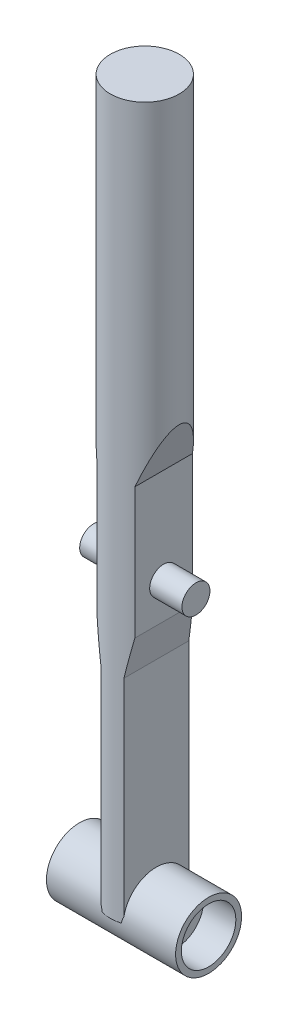
ISO-10303-21;
HEADER;
FILE_DESCRIPTION(('STEP AP214'),'2;1');
FILE_NAME('part.step','',(''),(''),'','','');
FILE_SCHEMA(('AUTOMOTIVE_DESIGN { 1 0 10303 214 1 1 1 1 }'));
ENDSEC;
DATA;
#1=APPLICATION_CONTEXT('core data for automotive mechanical design processes');
#2=APPLICATION_PROTOCOL_DEFINITION('international standard','automotive_design',2000,#1);
#3=PRODUCT_CONTEXT('',#1,'mechanical');
#4=PRODUCT('Part','Part','',(#3));
#5=PRODUCT_RELATED_PRODUCT_CATEGORY('part','',(#4));
#6=PRODUCT_DEFINITION_FORMATION('','',#4);
#7=PRODUCT_DEFINITION_CONTEXT('part definition',#1,'design');
#8=PRODUCT_DEFINITION('design','',#6,#7);
#9=PRODUCT_DEFINITION_SHAPE('','',#8);
#10=(LENGTH_UNIT() NAMED_UNIT(*) SI_UNIT(.MILLI.,.METRE.));
#11=(NAMED_UNIT(*) PLANE_ANGLE_UNIT() SI_UNIT($,.RADIAN.));
#12=(NAMED_UNIT(*) SI_UNIT($,.STERADIAN.) SOLID_ANGLE_UNIT());
#13=UNCERTAINTY_MEASURE_WITH_UNIT(LENGTH_MEASURE(1.E-05),#10,'distance_accuracy_value','');
#14=(GEOMETRIC_REPRESENTATION_CONTEXT(3) GLOBAL_UNCERTAINTY_ASSIGNED_CONTEXT((#13)) GLOBAL_UNIT_ASSIGNED_CONTEXT((#10,
#11,#12)) REPRESENTATION_CONTEXT('',''));
#15=CARTESIAN_POINT('',(0.,0.,0.));
#16=DIRECTION('',(0.,0.,1.));
#17=DIRECTION('',(1.,0.,0.));
#18=AXIS2_PLACEMENT_3D('',#15,#16,#17);
#19=CARTESIAN_POINT('',(13.1644790319999,1783.90993744682,39.9999497523784));
#20=DIRECTION('',(0.,-1.,0.));
#21=DIRECTION('',(0.,0.,-1.));
#22=AXIS2_PLACEMENT_3D('',#19,#20,#21);
#23=PLANE('',#22);
#24=DIRECTION('',(-1.,0.,0.));
#25=VECTOR('',#24,1.);
#26=CARTESIAN_POINT('',(73.8838807005568,1783.90993744682,38.3479186239237));
#27=LINE('',#26,#25);
#28=CARTESIAN_POINT('',(11.151054807447,1783.90993744682,38.3479186239237));
#29=VERTEX_POINT('',#28);
#30=CARTESIAN_POINT('',(-11.6026950748903,1783.90993744682,38.3479186239237));
#31=VERTEX_POINT('',#30);
#32=EDGE_CURVE('E11',#29,#31,#27,.T.);
#33=ORIENTED_EDGE('',*,*,#32,.F.);
#34=CARTESIAN_POINT('',(-0.22582013372161,1783.90993744682,-5.02476216061724E-05));
#35=DIRECTION('',(0.,-1.,0.));
#36=DIRECTION('',(0.,0.,-1.));
#37=AXIS2_PLACEMENT_3D('',#34,#35,#36);
#38=CIRCLE('',#37,40.);
#39=EDGE_CURVE('E121',#29,#31,#38,.T.);
#40=ORIENTED_EDGE('',*,*,#39,.T.);
#41=EDGE_LOOP('',(#33,#40));
#42=FACE_BOUND('',#41,.T.);
#43=ADVANCED_FACE('F38',(#42),#23,.T.);
#44=CARTESIAN_POINT('',(-0.22582013372161,2463.28027004074,-5.02476216061724E-05));
#45=DIRECTION('',(0.,-1.,0.));
#46=DIRECTION('',(0.,0.,-1.));
#47=AXIS2_PLACEMENT_3D('',#44,#45,#46);
#48=CYLINDRICAL_SURFACE('',#47,40.);
#49=ORIENTED_EDGE('',*,*,#39,.F.);
#50=CARTESIAN_POINT('',(11.151054807447,1783.90993744682,38.3479186239237));
#51=CARTESIAN_POINT('',(11.1510358402569,1784.09591639511,38.3479213542535));
#52=CARTESIAN_POINT('',(11.1556177414297,1784.2818613936,38.346565203044));
#53=CARTESIAN_POINT('',(11.1738052117104,1784.65322992802,38.3411635748634));
#54=CARTESIAN_POINT('',(11.1874087581552,1784.83865357148,38.3371187007066));
#55=CARTESIAN_POINT('',(11.2413814256477,1785.39249373955,38.321024495581));
#56=CARTESIAN_POINT('',(11.2949147099998,1785.75958385275,38.3050152190416));
#57=CARTESIAN_POINT('',(11.4324496884293,1786.47992446487,38.2633748600251));
#58=CARTESIAN_POINT('',(11.5158446973372,1786.83330534353,38.2379350338814));
#59=CARTESIAN_POINT('',(11.7090440877346,1787.53217069556,38.1780751547063));
#60=CARTESIAN_POINT('',(11.8188681867846,1787.8776490615,38.1436483952935));
#61=CARTESIAN_POINT('',(12.1378166092028,1788.77824521613,38.0418142192994));
#62=CARTESIAN_POINT('',(12.3655013436854,1789.32598045958,37.967402472921));
#63=CARTESIAN_POINT('',(12.8628049377956,1790.39878929427,37.7988506813096));
#64=CARTESIAN_POINT('',(13.132455262005,1790.92384550094,37.7046958147074));
#65=CARTESIAN_POINT('',(13.7044431518323,1791.96026627469,37.4971695639313));
#66=CARTESIAN_POINT('',(14.0071373461986,1792.47138770105,37.383579061378));
#67=CARTESIAN_POINT('',(14.6332497202106,1793.47617101262,37.1391622151639));
#68=CARTESIAN_POINT('',(14.9566626497798,1793.9698372721,37.0083402291148));
#69=CARTESIAN_POINT('',(15.6767418270358,1795.02905902546,36.7053574222309));
#70=CARTESIAN_POINT('',(16.0762056407638,1795.59178310209,36.5299825680185));
#71=CARTESIAN_POINT('',(16.8880546432706,1796.70030615409,36.1567629987183));
#72=CARTESIAN_POINT('',(17.3004426922283,1797.2461013291,35.9589132840729));
#73=CARTESIAN_POINT('',(18.1334827054965,1798.32338057592,35.54081962711));
#74=CARTESIAN_POINT('',(18.554141412768,1798.85485205553,35.3205567442733));
#75=CARTESIAN_POINT('',(19.3997195453942,1799.90447000025,34.8578115070049));
#76=CARTESIAN_POINT('',(19.8246386290091,1800.42261752242,34.6153309222342));
#77=CARTESIAN_POINT('',(20.6748294679453,1801.44516690428,34.1087035379585));
#78=CARTESIAN_POINT('',(21.1000970750271,1801.94960250364,33.844617853942));
#79=CARTESIAN_POINT('',(21.9499184582111,1802.94669243953,33.293988389982));
#80=CARTESIAN_POINT('',(22.3744722232596,1803.43934659515,33.0074442654861));
#81=CARTESIAN_POINT('',(23.2207748185555,1804.41279899594,32.4117503226011));
#82=CARTESIAN_POINT('',(23.6425248792086,1804.89360273236,32.1026112480266));
#83=CARTESIAN_POINT('',(24.4817008370615,1805.84342050969,31.4613130186487));
#84=CARTESIAN_POINT('',(24.8991267337329,1806.31243454915,31.1291538610325));
#85=CARTESIAN_POINT('',(26.0713597488342,1807.62177338318,30.1566605460357));
#86=CARTESIAN_POINT('',(26.8194205470995,1808.44808951926,29.4888240749158));
#87=CARTESIAN_POINT('',(27.9196637300987,1809.65409621248,28.4269046484567));
#88=CARTESIAN_POINT('',(28.2828035405589,1810.05055655366,28.0628666570179));
#89=CARTESIAN_POINT('',(29.0007974329042,1810.83178103705,27.3143018202486));
#90=CARTESIAN_POINT('',(29.3556491100116,1811.21654179419,26.9297691320939));
#91=CARTESIAN_POINT('',(30.4047609137449,1812.35078704484,25.7463651120054));
#92=CARTESIAN_POINT('',(31.0847947331443,1813.08156486088,24.9165225513618));
#93=CARTESIAN_POINT('',(32.3963022162756,1814.48495641815,23.1729299971066));
#94=CARTESIAN_POINT('',(33.0277725352854,1815.15756615356,22.2591742336192));
#95=CARTESIAN_POINT('',(34.0722969628933,1816.26658225071,20.5992660844231));
#96=CARTESIAN_POINT('',(34.4991354302263,1816.71860606802,19.8721850856245));
#97=CARTESIAN_POINT('',(35.3147685203705,1817.58069098421,18.3736723254074));
#98=CARTESIAN_POINT('',(35.7035850518426,1817.99077625487,17.6022665161573));
#99=CARTESIAN_POINT('',(36.4379658333624,1818.76412796363,16.0165056392759));
#100=CARTESIAN_POINT('',(36.783533066156,1819.12739763048,15.2021535390052));
#101=CARTESIAN_POINT('',(37.4258012286149,1819.80174521659,13.5334185248611));
#102=CARTESIAN_POINT('',(37.7225013019953,1820.11282222129,12.6790349098642));
#103=CARTESIAN_POINT('',(38.2642070533358,1820.68025328352,10.9255025144571));
#104=CARTESIAN_POINT('',(38.5086524301275,1820.93601452923,10.0259850032244));
#105=CARTESIAN_POINT('',(38.8295305729571,1821.2715244768,8.65446042684338));
#106=CARTESIAN_POINT('',(38.9288728363315,1821.37535430593,8.19348772699021));
#107=CARTESIAN_POINT('',(39.1117233640909,1821.56640855666,7.26502796155388));
#108=CARTESIAN_POINT('',(39.1952338122495,1821.65363526844,6.79754180397305));
#109=CARTESIAN_POINT('',(39.3458352619158,1821.81090232801,5.85747014449314));
#110=CARTESIAN_POINT('',(39.4129395762325,1821.88095661055,5.38488910419132));
#111=CARTESIAN_POINT('',(39.5303756406419,1822.00353438447,4.43545049503655));
#112=CARTESIAN_POINT('',(39.5807096973115,1822.05606028671,3.95859352356658));
#113=CARTESIAN_POINT('',(39.6642734557412,1822.14325327285,3.00178120800167));
#114=CARTESIAN_POINT('',(39.6975044138291,1822.17792166851,2.52182609410752));
#115=CARTESIAN_POINT('',(39.7466430109122,1822.22918295208,1.56012057286972));
#116=CARTESIAN_POINT('',(39.7625513981847,1822.24577662076,1.07837024397549));
#117=CARTESIAN_POINT('',(39.781909920586,1822.26596978841,-0.220867700901089));
#118=CARTESIAN_POINT('',(39.7690166818901,1822.25252241095,-1.0389881332275));
#119=CARTESIAN_POINT('',(39.6933147348628,1822.17355155716,-2.67017283391678));
#120=CARTESIAN_POINT('',(39.6305121186687,1822.10803443666,-3.48323770717442));
#121=CARTESIAN_POINT('',(39.4562499027128,1821.92617181877,-5.09838721563224));
#122=CARTESIAN_POINT('',(39.3447897144804,1821.80982570663,-5.90047171791349));
#123=CARTESIAN_POINT('',(39.0753011653734,1821.52837041083,-7.48805758127786));
#124=CARTESIAN_POINT('',(38.917271163761,1821.36325950909,-8.27355835704155));
#125=CARTESIAN_POINT('',(38.5625468105421,1820.99237225743,-9.80106348531759));
#126=CARTESIAN_POINT('',(38.3670813003323,1820.7878874584,-10.5436695010727));
#127=CARTESIAN_POINT('',(37.9377817708324,1820.33838327532,-12.0050272969815));
#128=CARTESIAN_POINT('',(37.7039498713555,1820.09336613075,-12.7237803924164));
#129=CARTESIAN_POINT('',(37.2010720865559,1819.56586711399,-14.1347165232186));
#130=CARTESIAN_POINT('',(36.9320231878642,1819.28338203579,-14.8268972783418));
#131=CARTESIAN_POINT('',(36.3619033576712,1818.68401947755,-16.1827400638659));
#132=CARTESIAN_POINT('',(36.0608257212933,1818.36713479603,-16.8463960819287));
#133=CARTESIAN_POINT('',(35.5157201938424,1817.79253298416,-17.9671901701323));
#134=CARTESIAN_POINT('',(35.2784372109143,1817.54215342881,-18.4314192711015));
#135=CARTESIAN_POINT('',(34.7898771096462,1817.02598632161,-19.3434877081235));
#136=CARTESIAN_POINT('',(34.5386025709473,1816.76020160968,-19.7913300403597));
#137=CARTESIAN_POINT('',(33.7652453550142,1815.94104372099,-21.1103901442752));
#138=CARTESIAN_POINT('',(33.2237208236953,1815.36596338311,-21.9569540469952));
#139=CARTESIAN_POINT('',(32.096479217992,1814.1645414238,-23.5850505672016));
#140=CARTESIAN_POINT('',(31.5106586904568,1813.53807949278,-24.3664213855391));
#141=CARTESIAN_POINT('',(30.3036784559777,1812.24142626211,-25.8626354668342));
#142=CARTESIAN_POINT('',(29.6825195109568,1811.57123590523,-26.5774801632702));
#143=CARTESIAN_POINT('',(28.6169305830848,1810.41472655431,-27.7217876068017));
#144=CARTESIAN_POINT('',(28.1800775963188,1809.93877717054,-28.1689630756174));
#145=CARTESIAN_POINT('',(27.2955104971928,1808.97044826142,-29.033804559072));
#146=CARTESIAN_POINT('',(26.8477966422275,1808.47806912534,-29.451471272131));
#147=CARTESIAN_POINT('',(25.9433333566323,1807.47764950331,-30.2579870702445));
#148=CARTESIAN_POINT('',(25.4865793223175,1806.96960096021,-30.646820967586));
#149=CARTESIAN_POINT('',(24.5663330767563,1805.9388168943,-31.3959274398791));
#150=CARTESIAN_POINT('',(24.1028410611918,1805.41608179761,-31.7562008423204));
#151=CARTESIAN_POINT('',(23.1718365024961,1804.35696079516,-32.4482498702702));
#152=CARTESIAN_POINT('',(22.7043295350328,1803.82059226568,-32.7800596236576));
#153=CARTESIAN_POINT('',(21.7670834831546,1802.7336031048,-33.416107850636));
#154=CARTESIAN_POINT('',(21.2973443005267,1802.18298184149,-33.7203450990464));
#155=CARTESIAN_POINT('',(20.3586841314991,1801.06742550008,-34.3014007515062));
#156=CARTESIAN_POINT('',(19.8897628253912,1800.5024990866,-34.5782352770359));
#157=CARTESIAN_POINT('',(18.9558839222512,1799.35709542077,-35.1048849104531));
#158=CARTESIAN_POINT('',(18.4909258227398,1798.77662017965,-35.3547034919741));
#159=CARTESIAN_POINT('',(17.6481276774097,1797.6989648637,-35.787008824613));
#160=CARTESIAN_POINT('',(17.2689760005268,1797.20449850738,-35.9737069606251));
#161=CARTESIAN_POINT('',(16.5198712105968,1796.20204965604,-36.3284613980803));
#162=CARTESIAN_POINT('',(16.1499179844365,1795.6940673274,-36.496517928847));
#163=CARTESIAN_POINT('',(15.4235630449023,1794.66189553031,-36.8138247294239));
#164=CARTESIAN_POINT('',(15.0671754170339,1794.13769018846,-36.9630558052403));
#165=CARTESIAN_POINT('',(14.3751102841695,1793.0706780946,-37.2418503991261));
#166=CARTESIAN_POINT('',(14.0394278006397,1792.52787586341,-37.3714186561316));
#167=CARTESIAN_POINT('',(13.502314718329,1791.59899317104,-37.571209885838));
#168=CARTESIAN_POINT('',(13.2925568295021,1791.21895598226,-37.6470793376391));
#169=CARTESIAN_POINT('',(12.8914086874593,1790.44730334226,-37.7887189703592));
#170=CARTESIAN_POINT('',(12.7000207925314,1790.05568641289,-37.8544878552443));
#171=CARTESIAN_POINT('',(12.3422611962941,1789.26231629565,-37.9747622399475));
#172=CARTESIAN_POINT('',(12.1757444627156,1788.86063921862,-38.0293337939355));
#173=CARTESIAN_POINT('',(11.8731538883538,1788.04456776127,-38.126683132196));
#174=CARTESIAN_POINT('',(11.7370642398866,1787.63018011227,-38.1694670431605));
#175=CARTESIAN_POINT('',(11.5458073009372,1786.94363941954,-38.2287678158522));
#176=CARTESIAN_POINT('',(11.4792571749622,1786.67497886846,-38.249165979773));
#177=CARTESIAN_POINT('',(11.3633284255502,1786.1336658935,-38.2844503207378));
#178=CARTESIAN_POINT('',(11.3139441334563,1785.86101481845,-38.2993383175044));
#179=CARTESIAN_POINT('',(11.2335636086294,1785.30963294681,-38.3234689533207));
#180=CARTESIAN_POINT('',(11.2027778722059,1785.03086825828,-38.3326470012477));
#181=CARTESIAN_POINT('',(11.1614447172302,1784.47140555754,-38.3449365074796));
#182=CARTESIAN_POINT('',(11.1509200835638,1784.19070572458,-38.3480411359051));
#183=CARTESIAN_POINT('',(11.1510548074471,1783.90993744682,-38.3480191191669));
#184=B_SPLINE_CURVE_WITH_KNOTS('',3,(#50,#51,#52,#53,#54,#55,#56,#57,#58,#59,#60,#61,#62,#63,
#64,#65,#66,#67,#68,#69,#70,#71,#72,#73,#74,#75,#76,#77,#78,#79,#80,#81,#82,#83,#84,#85,#86,#87,
#88,#89,#90,#91,#92,#93,#94,#95,#96,#97,#98,#99,#100,#101,#102,#103,#104,#105,#106,#107,#108,
#109,#110,#111,#112,#113,#114,#115,#116,#117,#118,#119,#120,#121,#122,#123,#124,#125,#126,#127,
#128,#129,#130,#131,#132,#133,#134,#135,#136,#137,#138,#139,#140,#141,#142,#143,#144,#145,#146,
#147,#148,#149,#150,#151,#152,#153,#154,#155,#156,#157,#158,#159,#160,#161,#162,#163,#164,#165,
#166,#167,#168,#169,#170,#171,#172,#173,#174,#175,#176,#177,#178,#179,#180,#181,#182,#183),
.UNSPECIFIED.,.F.,.F.,(4,2,2,2,2,2,2,2,2,2,2,2,2,2,2,2,2,2,2,2,2,2,2,2,2,2,2,2,2,2,2,2,2,2,2,2,
2,2,2,2,2,2,2,2,2,2,2,2,2,2,2,2,2,2,2,2,2,2,2,2,2,2,2,2,2,2,4),(0.,0.557810990211071,
1.11549696082689,2.22757115222124,3.3182266047878,4.40969828297229,6.19991750653114,
7.99148550916141,9.80477207782546,11.6176009678255,13.7528754978129,15.8886259556099,
18.0261964850073,20.1635969026419,22.2951473858825,24.4267305773139,26.5573067213381,
28.6878831256859,32.5820796835899,34.5295475567021,36.4775736336967,40.3672035937408,
44.2571012054612,47.1246084212579,49.9904534894255,52.8561008017026,55.7217983225342,
58.616832614496,60.0649006799878,61.5127688595179,62.95945823309,64.4059485471569,
65.8523325924389,67.2986541562641,69.7502001581431,72.201446960517,74.6527234093864,
77.1040862314358,79.4856599074153,81.8671020413679,84.2487480785663,86.6308936729006,
88.3653744868076,90.0995365643684,93.5685469761598,97.0459255744707,100.523229226253,
102.879604654624,105.235924293069,107.593476435657,109.950960247369,112.3055767355,
114.660297799458,117.013625203704,119.366649663121,121.317643810007,123.268613953677,
125.221557454416,127.174029526168,128.495507050509,129.817153996136,131.130764819608,
132.443691593105,133.275756118886,134.10754561117,134.948580953131,135.790561541066),.UNSPECIFIED.);
#185=CARTESIAN_POINT('',(13.1644790319999,1790.9715823204,37.6921225240889));
#186=VERTEX_POINT('',#185);
#187=EDGE_CURVE('E54',#29,#186,#184,.T.);
#188=ORIENTED_EDGE('',*,*,#187,.T.);
#189=DIRECTION('',(0.,-1.,0.));
#190=VECTOR('',#189,1.);
#191=CARTESIAN_POINT('',(13.1644790319999,2463.28027004074,37.6921225240889));
#192=LINE('',#191,#190);
#193=CARTESIAN_POINT('',(13.1644790319999,2031.02182205059,37.6921225240889));
#194=VERTEX_POINT('',#193);
#195=EDGE_CURVE('E168',#186,#194,#192,.F.);
#196=ORIENTED_EDGE('',*,*,#195,.T.);
#197=CARTESIAN_POINT('',(-0.22582013372161,1964.07032622199,-5.02476216061724E-05));
#198=DIRECTION('',(-0.98058067569092,0.196116135138186,0.));
#199=DIRECTION('',(-0.196116135138186,-0.98058067569092,0.));
#200=AXIS2_PLACEMENT_3D('',#197,#198,#199);
#201=ELLIPSE('',#200,203.96078054371,40.);
#202=CARTESIAN_POINT('',(21.6855785010956,2073.62731939607,33.4647164461137));
#203=VERTEX_POINT('',#202);
#204=EDGE_CURVE('E179',#194,#203,#201,.T.);
#205=ORIENTED_EDGE('',*,*,#204,.T.);
#206=DIRECTION('',(0.,-1.,0.));
#207=VECTOR('',#206,1.);
#208=CARTESIAN_POINT('',(21.6855785010956,2463.28027004074,33.4647164461136));
#209=LINE('',#208,#207);
#210=CARTESIAN_POINT('',(21.6855785010956,2225.78980991564,33.4647164461136));
#211=VERTEX_POINT('',#210);
#212=EDGE_CURVE('E154',#203,#211,#209,.F.);
#213=ORIENTED_EDGE('',*,*,#212,.T.);
#214=CARTESIAN_POINT('',(-0.22582013372161,2159.43457044173,-5.02476216061724E-05));
#215=DIRECTION('',(-0.949568288012403,0.313560307438928,0.));
#216=DIRECTION('',(-0.313560307438928,-0.949568288012403,0.));
#217=AXIS2_PLACEMENT_3D('',#214,#215,#216);
#218=ELLIPSE('',#217,127.567166669496,40.);
#219=CARTESIAN_POINT('',(21.6855785010956,2225.78980991564,-33.4648169413569));
#220=VERTEX_POINT('',#219);
#221=EDGE_CURVE('E145',#211,#220,#218,.T.);
#222=ORIENTED_EDGE('',*,*,#221,.T.);
#223=DIRECTION('',(0.,-1.,0.));
#224=VECTOR('',#223,1.);
#225=CARTESIAN_POINT('',(21.6855785010956,2463.28027004074,-33.4648169413569));
#226=LINE('',#225,#224);
#227=CARTESIAN_POINT('',(21.6855785010956,2073.62731939607,-33.4648169413569));
#228=VERTEX_POINT('',#227);
#229=EDGE_CURVE('E151',#220,#228,#226,.T.);
#230=ORIENTED_EDGE('',*,*,#229,.T.);
#231=CARTESIAN_POINT('',(13.1644790319999,2031.02182205059,-37.6922230193321));
#232=VERTEX_POINT('',#231);
#233=EDGE_CURVE('E180',#228,#232,#201,.T.);
#234=ORIENTED_EDGE('',*,*,#233,.T.);
#235=DIRECTION('',(0.,-1.,0.));
#236=VECTOR('',#235,1.);
#237=CARTESIAN_POINT('',(13.1644790319999,2463.28027004074,-37.6922230193321));
#238=LINE('',#237,#236);
#239=CARTESIAN_POINT('',(13.1644790319999,1790.9715823204,-37.6922230193321));
#240=VERTEX_POINT('',#239);
#241=EDGE_CURVE('E127',#232,#240,#238,.T.);
#242=ORIENTED_EDGE('',*,*,#241,.T.);
#243=CARTESIAN_POINT('',(11.151054807447,1783.90993744682,-38.3480191191669));
#244=VERTEX_POINT('',#243);
#245=EDGE_CURVE('E124',#240,#244,#184,.T.);
#246=ORIENTED_EDGE('',*,*,#245,.T.);
#247=CARTESIAN_POINT('',(-11.6026950748903,1783.90993744682,-38.3480191191669));
#248=VERTEX_POINT('',#247);
#249=EDGE_CURVE('E116',#248,#244,#38,.T.);
#250=ORIENTED_EDGE('',*,*,#249,.F.);
#251=CARTESIAN_POINT('',(-11.6026950748903,1783.90993744682,-38.3480191191669));
#252=CARTESIAN_POINT('',(-11.6026761077001,1784.09591639511,-38.3480218494967));
#253=CARTESIAN_POINT('',(-11.607258008873,1784.2818613936,-38.3466656982872));
#254=CARTESIAN_POINT('',(-11.6254454791536,1784.65322992802,-38.3412640701066));
#255=CARTESIAN_POINT('',(-11.6390490255984,1784.83865357148,-38.3372191959498));
#256=CARTESIAN_POINT('',(-11.693021693091,1785.39249373955,-38.3211249908242));
#257=CARTESIAN_POINT('',(-11.746554977443,1785.75958385275,-38.3051157142848));
#258=CARTESIAN_POINT('',(-11.8840899558725,1786.47992446487,-38.2634753552683));
#259=CARTESIAN_POINT('',(-11.9674849647803,1786.83330534353,-38.2380355291247));
#260=CARTESIAN_POINT('',(-12.1606843551777,1787.53217069556,-38.1781756499495));
#261=CARTESIAN_POINT('',(-12.2705084542278,1787.8776490615,-38.1437488905367));
#262=CARTESIAN_POINT('',(-12.589456876646,1788.77824521613,-38.0419147145426));
#263=CARTESIAN_POINT('',(-12.8171416111287,1789.32598045958,-37.9675029681642));
#264=CARTESIAN_POINT('',(-13.3144452052389,1790.39878929427,-37.7989511765528));
#265=CARTESIAN_POINT('',(-13.5840955294482,1790.92384550094,-37.7047963099506));
#266=CARTESIAN_POINT('',(-14.1560834192755,1791.96026627469,-37.4972700591745));
#267=CARTESIAN_POINT('',(-14.4587776136419,1792.47138770105,-37.3836795566212));
#268=CARTESIAN_POINT('',(-15.0848899876538,1793.47617101262,-37.1392627104072));
#269=CARTESIAN_POINT('',(-15.4083029172231,1793.9698372721,-37.0084407243581));
#270=CARTESIAN_POINT('',(-16.128382094479,1795.02905902546,-36.7054579174741));
#271=CARTESIAN_POINT('',(-16.527845908207,1795.59178310209,-36.5300830632617));
#272=CARTESIAN_POINT('',(-17.3396949107138,1796.70030615409,-36.1568634939616));
#273=CARTESIAN_POINT('',(-17.7520829596715,1797.2461013291,-35.9590137793161));
#274=CARTESIAN_POINT('',(-18.5851229729397,1798.32338057592,-35.5409201223532));
#275=CARTESIAN_POINT('',(-19.0057816802112,1798.85485205553,-35.3206572395165));
#276=CARTESIAN_POINT('',(-19.8513598128374,1799.90447000025,-34.8579120022481));
#277=CARTESIAN_POINT('',(-20.2762788964523,1800.42261752242,-34.6154314174774));
#278=CARTESIAN_POINT('',(-21.1264697353885,1801.44516690428,-34.1088040332017));
#279=CARTESIAN_POINT('',(-21.5517373424703,1801.94960250364,-33.8447183491852));
#280=CARTESIAN_POINT('',(-22.4015587256543,1802.94669243953,-33.2940888852252));
#281=CARTESIAN_POINT('',(-22.8261124907028,1803.43934659515,-33.0075447607293));
#282=CARTESIAN_POINT('',(-23.6724150859987,1804.41279899594,-32.4118508178443));
#283=CARTESIAN_POINT('',(-24.0941651466518,1804.89360273236,-32.1027117432698));
#284=CARTESIAN_POINT('',(-24.9333411045047,1805.84342050969,-31.4614135138919));
#285=CARTESIAN_POINT('',(-25.3507670011762,1806.31243454915,-31.1292543562757));
#286=CARTESIAN_POINT('',(-26.5230000162774,1807.62177338318,-30.1567610412789));
#287=CARTESIAN_POINT('',(-27.2710608145427,1808.44808951926,-29.488924570159));
#288=CARTESIAN_POINT('',(-28.3713039975419,1809.65409621248,-28.4270051437));
#289=CARTESIAN_POINT('',(-28.7344438080021,1810.05055655366,-28.0629671522612));
#290=CARTESIAN_POINT('',(-29.4524377003474,1810.83178103705,-27.3144023154918));
#291=CARTESIAN_POINT('',(-29.8072893774548,1811.21654179419,-26.9298696273371));
#292=CARTESIAN_POINT('',(-30.8564011811881,1812.35078704484,-25.7464656072486));
#293=CARTESIAN_POINT('',(-31.5364350005875,1813.08156486088,-24.9166230466051));
#294=CARTESIAN_POINT('',(-32.8479424837188,1814.48495641815,-23.1730304923499));
#295=CARTESIAN_POINT('',(-33.4794128027286,1815.15756615356,-22.2592747288624));
#296=CARTESIAN_POINT('',(-34.5239372303365,1816.26658225071,-20.5993665796664));
#297=CARTESIAN_POINT('',(-34.9507756976695,1816.71860606802,-19.8722855808677));
#298=CARTESIAN_POINT('',(-35.7664087878137,1817.58069098421,-18.3737728206506));
#299=CARTESIAN_POINT('',(-36.1552253192858,1817.99077625487,-17.6023670114005));
#300=CARTESIAN_POINT('',(-36.8896061008056,1818.76412796363,-16.0166061345192));
#301=CARTESIAN_POINT('',(-37.2351733335992,1819.12739763048,-15.2022540342485));
#302=CARTESIAN_POINT('',(-37.8774414960581,1819.80174521659,-13.5335190201044));
#303=CARTESIAN_POINT('',(-38.1741415694385,1820.11282222129,-12.6791354051074));
#304=CARTESIAN_POINT('',(-38.7158473207791,1820.68025328352,-10.9256030097003));
#305=CARTESIAN_POINT('',(-38.9602926975707,1820.93601452923,-10.0260854984676));
#306=CARTESIAN_POINT('',(-39.2811708404003,1821.2715244768,-8.6545609220866));
#307=CARTESIAN_POINT('',(-39.3805131037748,1821.37535430593,-8.19358822223343));
#308=CARTESIAN_POINT('',(-39.5633636315341,1821.56640855666,-7.26512845679709));
#309=CARTESIAN_POINT('',(-39.6468740796928,1821.65363526844,-6.79764229921627));
#310=CARTESIAN_POINT('',(-39.797475529359,1821.81090232801,-5.85757063973635));
#311=CARTESIAN_POINT('',(-39.8645798436757,1821.88095661055,-5.38498959943452));
#312=CARTESIAN_POINT('',(-39.9820159080851,1822.00353438447,-4.43555099027976));
#313=CARTESIAN_POINT('',(-40.0323499647547,1822.05606028671,-3.95869401880979));
#314=CARTESIAN_POINT('',(-40.1159137231844,1822.14325327285,-3.00188170324488));
#315=CARTESIAN_POINT('',(-40.1491446812724,1822.17792166851,-2.52192658935073));
#316=CARTESIAN_POINT('',(-40.1982832783554,1822.22918295208,-1.56022106811293));
#317=CARTESIAN_POINT('',(-40.2141916656279,1822.24577662076,-1.0784707392187));
#318=CARTESIAN_POINT('',(-40.2335501880293,1822.26596978841,0.220767205657876));
#319=CARTESIAN_POINT('',(-40.2206569493333,1822.25252241095,1.03888763798429));
#320=CARTESIAN_POINT('',(-40.144955002306,1822.17355155716,2.67007233867357));
#321=CARTESIAN_POINT('',(-40.082152386112,1822.10803443666,3.48313721193121));
#322=CARTESIAN_POINT('',(-39.907890170156,1821.92617181877,5.09828672038903));
#323=CARTESIAN_POINT('',(-39.7964299819236,1821.80982570663,5.90037122267028));
#324=CARTESIAN_POINT('',(-39.5269414328166,1821.52837041083,7.48795708603465));
#325=CARTESIAN_POINT('',(-39.3689114312042,1821.36325950909,8.27345786179834));
#326=CARTESIAN_POINT('',(-39.0141870779853,1820.99237225743,9.80096299007437));
#327=CARTESIAN_POINT('',(-38.8187215677755,1820.7878874584,10.5435690058295));
#328=CARTESIAN_POINT('',(-38.3894220382756,1820.33838327532,12.0049268017383));
#329=CARTESIAN_POINT('',(-38.1555901387988,1820.09336613075,12.7236798971732));
#330=CARTESIAN_POINT('',(-37.6527123539991,1819.56586711399,14.1346160279754));
#331=CARTESIAN_POINT('',(-37.3836634553074,1819.28338203579,14.8267967830986));
#332=CARTESIAN_POINT('',(-36.8135436251144,1818.68401947755,16.1826395686227));
#333=CARTESIAN_POINT('',(-36.5124659887365,1818.36713479603,16.8462955866855));
#334=CARTESIAN_POINT('',(-35.9673604612856,1817.79253298416,17.9670896748891));
#335=CARTESIAN_POINT('',(-35.7300774783575,1817.54215342881,18.4313187758583));
#336=CARTESIAN_POINT('',(-35.2415173770894,1817.02598632161,19.3433872128803));
#337=CARTESIAN_POINT('',(-34.9902428383905,1816.76020160968,19.7912295451165));
#338=CARTESIAN_POINT('',(-34.2168856224574,1815.94104372099,21.110289649032));
#339=CARTESIAN_POINT('',(-33.6753610911385,1815.36596338311,21.956853551752));
#340=CARTESIAN_POINT('',(-32.5481194854352,1814.1645414238,23.5849500719584));
#341=CARTESIAN_POINT('',(-31.9622989579,1813.53807949278,24.3663208902959));
#342=CARTESIAN_POINT('',(-30.7553187234209,1812.24142626211,25.862534971591));
#343=CARTESIAN_POINT('',(-30.1341597784001,1811.57123590523,26.577379668027));
#344=CARTESIAN_POINT('',(-29.068570850528,1810.41472655431,27.7216871115586));
#345=CARTESIAN_POINT('',(-28.6317178637619,1809.93877717054,28.1688625803742));
#346=CARTESIAN_POINT('',(-27.747150764636,1808.97044826142,29.0337040638288));
#347=CARTESIAN_POINT('',(-27.2994369096707,1808.47806912534,29.4513707768878));
#348=CARTESIAN_POINT('',(-26.3949736240756,1807.47764950331,30.2578865750012));
#349=CARTESIAN_POINT('',(-25.9382195897608,1806.96960096021,30.6467204723428));
#350=CARTESIAN_POINT('',(-25.0179733441995,1805.9388168943,31.3958269446359));
#351=CARTESIAN_POINT('',(-24.554481328635,1805.41608179761,31.7561003470771));
#352=CARTESIAN_POINT('',(-23.6234767699394,1804.35696079516,32.448149375027));
#353=CARTESIAN_POINT('',(-23.1559698024761,1803.82059226568,32.7799591284143));
#354=CARTESIAN_POINT('',(-22.2187237505979,1802.7336031048,33.4160073553927));
#355=CARTESIAN_POINT('',(-21.74898456797,1802.18298184149,33.7202446038031));
#356=CARTESIAN_POINT('',(-20.8103243989423,1801.06742550008,34.301300256263));
#357=CARTESIAN_POINT('',(-20.3414030928344,1800.5024990866,34.5781347817926));
#358=CARTESIAN_POINT('',(-19.4075241896944,1799.35709542077,35.1047844152099));
#359=CARTESIAN_POINT('',(-18.9425660901831,1798.77662017965,35.3546029967309));
#360=CARTESIAN_POINT('',(-18.0997679448529,1797.6989648637,35.7869083293698));
#361=CARTESIAN_POINT('',(-17.72061626797,1797.20449850738,35.9736064653819));
#362=CARTESIAN_POINT('',(-16.97151147804,1796.20204965604,36.3283609028371));
#363=CARTESIAN_POINT('',(-16.6015582518797,1795.6940673274,36.4964174336038));
#364=CARTESIAN_POINT('',(-15.8752033123456,1794.66189553031,36.8137242341807));
#365=CARTESIAN_POINT('',(-15.5188156844771,1794.13769018846,36.9629553099971));
#366=CARTESIAN_POINT('',(-14.8267505516127,1793.0706780946,37.2417499038829));
#367=CARTESIAN_POINT('',(-14.491068068083,1792.52787586341,37.3713181608884));
#368=CARTESIAN_POINT('',(-13.9539549857722,1791.59899317104,37.5711093905948));
#369=CARTESIAN_POINT('',(-13.7441970969453,1791.21895598226,37.6469788423959));
#370=CARTESIAN_POINT('',(-13.3430489549025,1790.44730334226,37.788618475116));
#371=CARTESIAN_POINT('',(-13.1516610599746,1790.05568641289,37.8543873600011));
#372=CARTESIAN_POINT('',(-12.7939014637373,1789.26231629565,37.9746617447043));
#373=CARTESIAN_POINT('',(-12.6273847301588,1788.86063921862,38.0292332986923));
#374=CARTESIAN_POINT('',(-12.324794155797,1788.04456776127,38.1265826369528));
#375=CARTESIAN_POINT('',(-12.1887045073298,1787.63018011227,38.1693665479173));
#376=CARTESIAN_POINT('',(-11.9974475683804,1786.94363941954,38.228667320609));
#377=CARTESIAN_POINT('',(-11.9308974424054,1786.67497886846,38.2490654845298));
#378=CARTESIAN_POINT('',(-11.8149686929934,1786.1336658935,38.2843498254946));
#379=CARTESIAN_POINT('',(-11.7655844008995,1785.86101481845,38.2992378222612));
#380=CARTESIAN_POINT('',(-11.6852038760726,1785.30963294681,38.3233684580775));
#381=CARTESIAN_POINT('',(-11.6544181396491,1785.03086825828,38.3325465060045));
#382=CARTESIAN_POINT('',(-11.6130849846734,1784.47140555754,38.3448360122364));
#383=CARTESIAN_POINT('',(-11.602560351007,1784.19070572458,38.3479406406619));
#384=CARTESIAN_POINT('',(-11.6026950748903,1783.90993744682,38.3479186239237));
#385=B_SPLINE_CURVE_WITH_KNOTS('',3,(#251,#252,#253,#254,#255,#256,#257,#258,#259,#260,#261,
#262,#263,#264,#265,#266,#267,#268,#269,#270,#271,#272,#273,#274,#275,#276,#277,#278,#279,#280,
#281,#282,#283,#284,#285,#286,#287,#288,#289,#290,#291,#292,#293,#294,#295,#296,#297,#298,#299,
#300,#301,#302,#303,#304,#305,#306,#307,#308,#309,#310,#311,#312,#313,#314,#315,#316,#317,#318,
#319,#320,#321,#322,#323,#324,#325,#326,#327,#328,#329,#330,#331,#332,#333,#334,#335,#336,#337,
#338,#339,#340,#341,#342,#343,#344,#345,#346,#347,#348,#349,#350,#351,#352,#353,#354,#355,#356,
#357,#358,#359,#360,#361,#362,#363,#364,#365,#366,#367,#368,#369,#370,#371,#372,#373,#374,#375,
#376,#377,#378,#379,#380,#381,#382,#383,#384),.UNSPECIFIED.,.F.,.F.,(4,2,2,2,2,2,2,2,2,2,2,2,2,
2,2,2,2,2,2,2,2,2,2,2,2,2,2,2,2,2,2,2,2,2,2,2,2,2,2,2,2,2,2,2,2,2,2,2,2,2,2,2,2,2,2,2,2,2,2,2,2,
2,2,2,2,2,4),(0.,0.557810990211071,1.11549696082689,2.22757115222124,3.31822660478757,
4.40969828297229,6.19991750653114,7.99148550916141,9.80477207782546,11.6176009678255,
13.7528754978129,15.8886259556099,18.0261964850073,20.1635969026419,22.2951473858825,
24.4267305773139,26.5573067213381,28.6878831256859,32.5820796835899,34.5295475567021,
36.4775736336967,40.3672035937407,44.2571012054612,47.1246084212579,49.9904534894255,
52.8561008017025,55.7217983225342,58.616832614496,60.0649006799878,61.5127688595179,
62.95945823309,64.4059485471569,65.8523325924389,67.2986541562641,69.7502001581431,
72.201446960517,74.6527234093863,77.1040862314358,79.4856599074153,81.8671020413679,
84.2487480785663,86.6308936729006,88.3653744868076,90.0995365643684,93.5685469761598,
97.0459255744705,100.523229226253,102.879604654624,105.235924293069,107.593476435657,
109.950960247369,112.3055767355,114.660297799458,117.013625203704,119.366649663121,
121.317643810007,123.268613953677,125.221557454416,127.174029526168,128.495507050509,
129.817153996136,131.130764819608,132.443691593105,133.275756118886,134.107545611169,
134.948580953131,135.790561541066),.UNSPECIFIED.);
#386=CARTESIAN_POINT('',(-13.6161192994432,1790.9715823204,-37.6922230193321));
#387=VERTEX_POINT('',#386);
#388=EDGE_CURVE('E130',#248,#387,#385,.T.);
#389=ORIENTED_EDGE('',*,*,#388,.T.);
#390=DIRECTION('',(0.,-1.,0.));
#391=VECTOR('',#390,1.);
#392=CARTESIAN_POINT('',(-13.6161192994432,2463.28027004074,-37.6922230193321));
#393=LINE('',#392,#391);
#394=CARTESIAN_POINT('',(-13.6161192994432,2031.02182205059,-37.6922230193321));
#395=VERTEX_POINT('',#394);
#396=EDGE_CURVE('E173',#387,#395,#393,.F.);
#397=ORIENTED_EDGE('',*,*,#396,.T.);
#398=CARTESIAN_POINT('',(-0.22582013372161,1964.07032622199,-5.02476216061724E-05));
#399=DIRECTION('',(0.98058067569092,0.196116135138186,0.));
#400=DIRECTION('',(0.196116135138186,-0.98058067569092,0.));
#401=AXIS2_PLACEMENT_3D('',#398,#399,#400);
#402=ELLIPSE('',#401,203.96078054371,40.);
#403=CARTESIAN_POINT('',(-22.1372187685388,2073.62731939607,-33.4648169413569));
#404=VERTEX_POINT('',#403);
#405=EDGE_CURVE('E175',#395,#404,#402,.T.);
#406=ORIENTED_EDGE('',*,*,#405,.T.);
#407=DIRECTION('',(0.,-1.,0.));
#408=VECTOR('',#407,1.);
#409=CARTESIAN_POINT('',(-22.1372187685388,2463.28027004074,-33.4648169413569));
#410=LINE('',#409,#408);
#411=CARTESIAN_POINT('',(-22.1372187685388,2225.78980991564,-33.4648169413569));
#412=VERTEX_POINT('',#411);
#413=EDGE_CURVE('E159',#404,#412,#410,.F.);
#414=ORIENTED_EDGE('',*,*,#413,.T.);
#415=CARTESIAN_POINT('',(-0.22582013372161,2159.43457044173,-5.02476216061724E-05));
#416=DIRECTION('',(0.949568288012403,0.313560307438928,0.));
#417=DIRECTION('',(0.313560307438928,-0.949568288012403,0.));
#418=AXIS2_PLACEMENT_3D('',#415,#416,#417);
#419=ELLIPSE('',#418,127.567166669496,40.);
#420=CARTESIAN_POINT('',(-22.1372187685388,2225.78980991564,33.4647164461136));
#421=VERTEX_POINT('',#420);
#422=EDGE_CURVE('E148',#412,#421,#419,.T.);
#423=ORIENTED_EDGE('',*,*,#422,.T.);
#424=DIRECTION('',(0.,-1.,0.));
#425=VECTOR('',#424,1.);
#426=CARTESIAN_POINT('',(-22.1372187685388,2463.28027004074,33.4647164461136));
#427=LINE('',#426,#425);
#428=CARTESIAN_POINT('',(-22.1372187685388,2073.62731939607,33.4647164461136));
#429=VERTEX_POINT('',#428);
#430=EDGE_CURVE('E156',#421,#429,#427,.T.);
#431=ORIENTED_EDGE('',*,*,#430,.T.);
#432=CARTESIAN_POINT('',(-13.6161192994432,2031.02182205059,37.6921225240889));
#433=VERTEX_POINT('',#432);
#434=EDGE_CURVE('E176',#429,#433,#402,.T.);
#435=ORIENTED_EDGE('',*,*,#434,.T.);
#436=DIRECTION('',(0.,-1.,0.));
#437=VECTOR('',#436,1.);
#438=CARTESIAN_POINT('',(-13.6161192994432,2463.28027004074,37.6921225240889));
#439=LINE('',#438,#437);
#440=CARTESIAN_POINT('',(-13.6161192994432,1790.9715823204,37.6921225240889));
#441=VERTEX_POINT('',#440);
#442=EDGE_CURVE('E170',#433,#441,#439,.T.);
#443=ORIENTED_EDGE('',*,*,#442,.T.);
#444=EDGE_CURVE('E198',#441,#31,#385,.T.);
#445=ORIENTED_EDGE('',*,*,#444,.T.);
#446=EDGE_LOOP('',(#49,#188,#196,#205,#213,#222,#230,#234,#242,#246,#250,#389,#397,#406,#414,
#423,#431,#435,#443,#445));
#447=FACE_BOUND('',#446,.T.);
#448=CARTESIAN_POINT('',(-0.22582013372161,2613.28027004074,-5.02476216061724E-05));
#449=DIRECTION('',(0.,1.,0.));
#450=DIRECTION('',(0.,0.,1.));
#451=AXIS2_PLACEMENT_3D('',#448,#449,#450);
#452=CIRCLE('',#451,40.);
#453=CARTESIAN_POINT('',(-0.22582013372161,2613.28027004074,39.9999497523784));
#454=VERTEX_POINT('',#453);
#455=EDGE_CURVE('E292',#454,#454,#452,.T.);
#456=ORIENTED_EDGE('',*,*,#455,.F.);
#457=EDGE_LOOP('',(#456));
#458=FACE_BOUND('',#457,.T.);
#459=ADVANCED_FACE('F40',(#447,#458),#48,.T.);
#460=CARTESIAN_POINT('',(13.1644790319999,2031.02182205059,-40.0000502476216));
#461=DIRECTION('',(-1.,0.,0.));
#462=DIRECTION('',(0.,0.,1.));
#463=AXIS2_PLACEMENT_3D('',#460,#461,#462);
#464=PLANE('',#463);
#465=ORIENTED_EDGE('',*,*,#195,.F.);
#466=CARTESIAN_POINT('',(13.1644790319999,1783.90993744682,-5.02476216061724E-05));
#467=DIRECTION('',(-1.,0.,0.));
#468=DIRECTION('',(0.,0.,1.));
#469=AXIS2_PLACEMENT_3D('',#466,#467,#468);
#470=CIRCLE('',#469,38.3479688715453);
#471=EDGE_CURVE('E61',#186,#240,#470,.T.);
#472=ORIENTED_EDGE('',*,*,#471,.T.);
#473=ORIENTED_EDGE('',*,*,#241,.F.);
#474=DIRECTION('',(0.,0.,1.));
#475=VECTOR('',#474,1.);
#476=CARTESIAN_POINT('',(13.1644790319999,2031.02182205059,-40.0000502476216));
#477=LINE('',#476,#475);
#478=EDGE_CURVE('E182',#232,#194,#477,.T.);
#479=ORIENTED_EDGE('',*,*,#478,.T.);
#480=EDGE_LOOP('',(#465,#472,#473,#479));
#481=FACE_BOUND('',#480,.T.);
#482=ADVANCED_FACE('F236',(#481),#464,.F.);
#483=CARTESIAN_POINT('',(-13.6161192994432,2031.02182205059,-40.0000502476216));
#484=DIRECTION('',(1.,0.,0.));
#485=DIRECTION('',(0.,0.,-1.));
#486=AXIS2_PLACEMENT_3D('',#483,#484,#485);
#487=PLANE('',#486);
#488=ORIENTED_EDGE('',*,*,#396,.F.);
#489=CARTESIAN_POINT('',(-13.6161192994432,1783.90993744682,-5.02476216061724E-05));
#490=DIRECTION('',(1.,0.,0.));
#491=DIRECTION('',(0.,0.,-1.));
#492=AXIS2_PLACEMENT_3D('',#489,#490,#491);
#493=CIRCLE('',#492,38.3479688715453);
#494=EDGE_CURVE('E129',#387,#441,#493,.T.);
#495=ORIENTED_EDGE('',*,*,#494,.T.);
#496=ORIENTED_EDGE('',*,*,#442,.F.);
#497=DIRECTION('',(0.,0.,1.));
#498=VECTOR('',#497,1.);
#499=CARTESIAN_POINT('',(-13.6161192994432,2031.02182205059,-40.0000502476216));
#500=LINE('',#499,#498);
#501=EDGE_CURVE('E183',#395,#433,#500,.T.);
#502=ORIENTED_EDGE('',*,*,#501,.F.);
#503=EDGE_LOOP('',(#488,#495,#496,#502));
#504=FACE_BOUND('',#503,.T.);
#505=ADVANCED_FACE('F239',(#504),#487,.F.);
#506=CARTESIAN_POINT('',(-40.2258201337216,2280.56830650268,-40.0000502476216));
#507=DIRECTION('',(0.949568288012403,0.313560307438928,0.));
#508=DIRECTION('',(-0.313560307438928,0.949568288012403,0.));
#509=AXIS2_PLACEMENT_3D('',#506,#507,#508);
#510=PLANE('',#509);
#511=DIRECTION('',(0.,0.,1.));
#512=VECTOR('',#511,1.);
#513=CARTESIAN_POINT('',(-22.1372187685388,2225.78980991564,-40.0000502476216));
#514=LINE('',#513,#512);
#515=EDGE_CURVE('E162',#412,#421,#514,.T.);
#516=ORIENTED_EDGE('',*,*,#515,.T.);
#517=ORIENTED_EDGE('',*,*,#422,.F.);
#518=EDGE_LOOP('',(#516,#517));
#519=FACE_BOUND('',#518,.T.);
#520=ADVANCED_FACE('F250',(#519),#510,.F.);
#521=CARTESIAN_POINT('',(-22.1372187685388,2225.78980991564,-40.0000502476216));
#522=DIRECTION('',(1.,0.,0.));
#523=DIRECTION('',(0.,0.,-1.));
#524=AXIS2_PLACEMENT_3D('',#521,#522,#523);
#525=PLANE('',#524);
#526=CARTESIAN_POINT('',(-22.1372187685388,2115.01551681739,-5.02476216061724E-05));
#527=DIRECTION('',(1.,0.,0.));
#528=DIRECTION('',(0.,0.,-1.));
#529=AXIS2_PLACEMENT_3D('',#526,#527,#528);
#530=CIRCLE('',#529,16.25);
#531=CARTESIAN_POINT('',(-22.1372187685388,2115.01551681739,-16.2500502476216));
#532=VERTEX_POINT('',#531);
#533=EDGE_CURVE('E192',#532,#532,#530,.T.);
#534=ORIENTED_EDGE('',*,*,#533,.T.);
#535=EDGE_LOOP('',(#534));
#536=FACE_BOUND('',#535,.T.);
#537=ORIENTED_EDGE('',*,*,#413,.F.);
#538=DIRECTION('',(0.,0.,1.));
#539=VECTOR('',#538,1.);
#540=CARTESIAN_POINT('',(-22.1372187685388,2073.62731939607,-40.0000502476216));
#541=LINE('',#540,#539);
#542=EDGE_CURVE('E137',#404,#429,#541,.T.);
#543=ORIENTED_EDGE('',*,*,#542,.T.);
#544=ORIENTED_EDGE('',*,*,#430,.F.);
#545=ORIENTED_EDGE('',*,*,#515,.F.);
#546=EDGE_LOOP('',(#537,#543,#544,#545));
#547=FACE_BOUND('',#546,.T.);
#548=ADVANCED_FACE('F258',(#536,#547),#525,.F.);
#549=CARTESIAN_POINT('',(39.7741798662784,2280.56830650268,-40.0000502476216));
#550=DIRECTION('',(-0.949568288012403,0.313560307438928,0.));
#551=DIRECTION('',(-0.313560307438928,-0.949568288012403,0.));
#552=AXIS2_PLACEMENT_3D('',#549,#550,#551);
#553=PLANE('',#552);
#554=DIRECTION('',(0.,0.,1.));
#555=VECTOR('',#554,1.);
#556=CARTESIAN_POINT('',(21.6855785010956,2225.78980991564,-40.0000502476216));
#557=LINE('',#556,#555);
#558=EDGE_CURVE('E161',#220,#211,#557,.T.);
#559=ORIENTED_EDGE('',*,*,#558,.F.);
#560=ORIENTED_EDGE('',*,*,#221,.F.);
#561=EDGE_LOOP('',(#559,#560));
#562=FACE_BOUND('',#561,.T.);
#563=ADVANCED_FACE('F254',(#562),#553,.F.);
#564=CARTESIAN_POINT('',(21.6855785010956,2225.78980991564,-40.0000502476216));
#565=DIRECTION('',(-1.,0.,0.));
#566=DIRECTION('',(0.,0.,1.));
#567=AXIS2_PLACEMENT_3D('',#564,#565,#566);
#568=PLANE('',#567);
#569=CARTESIAN_POINT('',(21.6855785010956,2115.01551681739,-5.02476216061724E-05));
#570=DIRECTION('',(-1.,0.,0.));
#571=DIRECTION('',(0.,0.,1.));
#572=AXIS2_PLACEMENT_3D('',#569,#570,#571);
#573=CIRCLE('',#572,16.25);
#574=CARTESIAN_POINT('',(21.6855785010956,2115.01551681739,16.2499497523784));
#575=VERTEX_POINT('',#574);
#576=EDGE_CURVE('E135',#575,#575,#573,.F.);
#577=ORIENTED_EDGE('',*,*,#576,.F.);
#578=EDGE_LOOP('',(#577));
#579=FACE_BOUND('',#578,.T.);
#580=ORIENTED_EDGE('',*,*,#212,.F.);
#581=DIRECTION('',(0.,0.,-1.));
#582=VECTOR('',#581,1.);
#583=CARTESIAN_POINT('',(21.6855785010956,2073.62731939607,-40.0000502476216));
#584=LINE('',#583,#582);
#585=EDGE_CURVE('E142',#203,#228,#584,.T.);
#586=ORIENTED_EDGE('',*,*,#585,.T.);
#587=ORIENTED_EDGE('',*,*,#229,.F.);
#588=ORIENTED_EDGE('',*,*,#558,.T.);
#589=EDGE_LOOP('',(#580,#586,#587,#588));
#590=FACE_BOUND('',#589,.T.);
#591=ADVANCED_FACE('F243',(#579,#590),#568,.F.);
#592=CARTESIAN_POINT('',(21.6855785010956,2073.62731939607,-40.0000502476216));
#593=DIRECTION('',(-0.98058067569092,0.196116135138186,0.));
#594=DIRECTION('',(-0.196116135138186,-0.98058067569092,0.));
#595=AXIS2_PLACEMENT_3D('',#592,#593,#594);
#596=PLANE('',#595);
#597=ORIENTED_EDGE('',*,*,#478,.F.);
#598=ORIENTED_EDGE('',*,*,#233,.F.);
#599=ORIENTED_EDGE('',*,*,#585,.F.);
#600=ORIENTED_EDGE('',*,*,#204,.F.);
#601=EDGE_LOOP('',(#597,#598,#599,#600));
#602=FACE_BOUND('',#601,.T.);
#603=ADVANCED_FACE('F240',(#602),#596,.F.);
#604=CARTESIAN_POINT('',(-22.1372187685388,2073.62731939607,-40.0000502476216));
#605=DIRECTION('',(0.98058067569092,0.196116135138186,0.));
#606=DIRECTION('',(-0.196116135138186,0.98058067569092,0.));
#607=AXIS2_PLACEMENT_3D('',#604,#605,#606);
#608=PLANE('',#607);
#609=ORIENTED_EDGE('',*,*,#501,.T.);
#610=ORIENTED_EDGE('',*,*,#434,.F.);
#611=ORIENTED_EDGE('',*,*,#542,.F.);
#612=ORIENTED_EDGE('',*,*,#405,.F.);
#613=EDGE_LOOP('',(#609,#610,#611,#612));
#614=FACE_BOUND('',#613,.T.);
#615=ADVANCED_FACE('F234',(#614),#608,.F.);
#616=CARTESIAN_POINT('',(59.1855785010956,2115.01551681739,-5.02476216061724E-05));
#617=DIRECTION('',(-1.,0.,0.));
#618=DIRECTION('',(0.,0.,1.));
#619=AXIS2_PLACEMENT_3D('',#616,#617,#618);
#620=CYLINDRICAL_SURFACE('',#619,16.25);
#621=CARTESIAN_POINT('',(59.1855785010956,2115.01551681739,-5.02476216061724E-05));
#622=DIRECTION('',(1.,0.,0.));
#623=DIRECTION('',(0.,0.,-1.));
#624=AXIS2_PLACEMENT_3D('',#621,#622,#623);
#625=CIRCLE('',#624,16.25);
#626=CARTESIAN_POINT('',(59.1855785010956,2115.01551681739,-16.2500502476216));
#627=VERTEX_POINT('',#626);
#628=EDGE_CURVE('E186',#627,#627,#625,.T.);
#629=ORIENTED_EDGE('',*,*,#628,.F.);
#630=EDGE_LOOP('',(#629));
#631=FACE_BOUND('',#630,.T.);
#632=ORIENTED_EDGE('',*,*,#576,.T.);
#633=EDGE_LOOP('',(#632));
#634=FACE_BOUND('',#633,.T.);
#635=ADVANCED_FACE('F230',(#631,#634),#620,.T.);
#636=CARTESIAN_POINT('',(59.1855785010956,2115.01551681739,-5.02476216061724E-05));
#637=DIRECTION('',(1.,0.,0.));
#638=DIRECTION('',(0.,0.,-1.));
#639=AXIS2_PLACEMENT_3D('',#636,#637,#638);
#640=PLANE('',#639);
#641=ORIENTED_EDGE('',*,*,#628,.T.);
#642=EDGE_LOOP('',(#641));
#643=FACE_BOUND('',#642,.T.);
#644=ADVANCED_FACE('F226',(#643),#640,.T.);
#645=CARTESIAN_POINT('',(-59.6372187685388,2115.01551681739,-5.02476216061724E-05));
#646=DIRECTION('',(1.,0.,0.));
#647=DIRECTION('',(0.,0.,-1.));
#648=AXIS2_PLACEMENT_3D('',#645,#646,#647);
#649=CYLINDRICAL_SURFACE('',#648,16.25);
#650=CARTESIAN_POINT('',(-59.6372187685388,2115.01551681739,-5.02476216061724E-05));
#651=DIRECTION('',(1.,0.,0.));
#652=DIRECTION('',(0.,0.,-1.));
#653=AXIS2_PLACEMENT_3D('',#650,#651,#652);
#654=CIRCLE('',#653,16.25);
#655=CARTESIAN_POINT('',(-59.6372187685388,2115.01551681739,-16.2500502476216));
#656=VERTEX_POINT('',#655);
#657=EDGE_CURVE('E191',#656,#656,#654,.T.);
#658=ORIENTED_EDGE('',*,*,#657,.T.);
#659=EDGE_LOOP('',(#658));
#660=FACE_BOUND('',#659,.T.);
#661=ORIENTED_EDGE('',*,*,#533,.F.);
#662=EDGE_LOOP('',(#661));
#663=FACE_BOUND('',#662,.T.);
#664=ADVANCED_FACE('F222',(#660,#663),#649,.T.);
#665=CARTESIAN_POINT('',(-59.6372187685388,2115.01551681739,-5.02476216061724E-05));
#666=DIRECTION('',(-1.,0.,0.));
#667=DIRECTION('',(0.,0.,-1.));
#668=AXIS2_PLACEMENT_3D('',#665,#666,#667);
#669=PLANE('',#668);
#670=ORIENTED_EDGE('',*,*,#657,.F.);
#671=EDGE_LOOP('',(#670));
#672=FACE_BOUND('',#671,.T.);
#673=ADVANCED_FACE('F219',(#672),#669,.T.);
#674=DIRECTION('',(-1.,0.,0.));
#675=VECTOR('',#674,1.);
#676=CARTESIAN_POINT('',(73.8838807005568,1783.90993744682,-38.3480191191669));
#677=LINE('',#676,#675);
#678=EDGE_CURVE('E47',#248,#244,#677,.F.);
#679=ORIENTED_EDGE('',*,*,#678,.F.);
#680=ORIENTED_EDGE('',*,*,#249,.T.);
#681=EDGE_LOOP('',(#679,#680));
#682=FACE_BOUND('',#681,.T.);
#683=ADVANCED_FACE('F118',(#682),#23,.T.);
#684=CARTESIAN_POINT('',(73.8838807005568,1783.90993744682,-5.02476216061724E-05));
#685=DIRECTION('',(-1.,0.,0.));
#686=DIRECTION('',(0.,0.,1.));
#687=AXIS2_PLACEMENT_3D('',#684,#685,#686);
#688=CYLINDRICAL_SURFACE('',#687,38.3479688715453);
#689=ORIENTED_EDGE('',*,*,#187,.F.);
#690=ORIENTED_EDGE('',*,*,#32,.T.);
#691=ORIENTED_EDGE('',*,*,#444,.F.);
#692=ORIENTED_EDGE('',*,*,#494,.F.);
#693=ORIENTED_EDGE('',*,*,#388,.F.);
#694=ORIENTED_EDGE('',*,*,#678,.T.);
#695=ORIENTED_EDGE('',*,*,#245,.F.);
#696=ORIENTED_EDGE('',*,*,#471,.F.);
#697=EDGE_LOOP('',(#689,#690,#691,#692,#693,#694,#695,#696));
#698=FACE_BOUND('',#697,.T.);
#699=CARTESIAN_POINT('',(73.8838807005568,1783.90993744682,-5.02476216061724E-05));
#700=DIRECTION('',(-1.,0.,0.));
#701=DIRECTION('',(0.,0.,1.));
#702=AXIS2_PLACEMENT_3D('',#699,#700,#701);
#703=CIRCLE('',#702,38.3479688715453);
#704=CARTESIAN_POINT('',(73.8838807005568,1783.90993744682,38.3479186239237));
#705=VERTEX_POINT('',#704);
#706=EDGE_CURVE('E274',#705,#705,#703,.T.);
#707=ORIENTED_EDGE('',*,*,#706,.T.);
#708=EDGE_LOOP('',(#707));
#709=FACE_BOUND('',#708,.T.);
#710=CARTESIAN_POINT('',(-76.1161192994431,1783.90993744682,-5.02476216061724E-05));
#711=DIRECTION('',(-1.,0.,0.));
#712=DIRECTION('',(0.,0.,1.));
#713=AXIS2_PLACEMENT_3D('',#710,#711,#712);
#714=CIRCLE('',#713,38.3479688715453);
#715=CARTESIAN_POINT('',(-76.1161192994431,1783.90993744682,38.3479186239237));
#716=VERTEX_POINT('',#715);
#717=EDGE_CURVE('E277',#716,#716,#714,.T.);
#718=ORIENTED_EDGE('',*,*,#717,.F.);
#719=EDGE_LOOP('',(#718));
#720=FACE_BOUND('',#719,.T.);
#721=ADVANCED_FACE('F132',(#698,#709,#720),#688,.T.);
#722=CARTESIAN_POINT('',(73.8838807005568,1783.90993744682,-5.02476216061724E-05));
#723=DIRECTION('',(-1.,0.,0.));
#724=DIRECTION('',(0.,0.,1.));
#725=AXIS2_PLACEMENT_3D('',#722,#723,#724);
#726=PLANE('',#725);
#727=CARTESIAN_POINT('',(73.8838807005568,1783.90993744682,-5.02476216061724E-05));
#728=DIRECTION('',(1.,0.,0.));
#729=DIRECTION('',(0.,0.,-1.));
#730=AXIS2_PLACEMENT_3D('',#727,#728,#729);
#731=CIRCLE('',#730,31.6512496398912);
#732=CARTESIAN_POINT('',(73.8838807005568,1783.90993744682,-31.6512998875128));
#733=VERTEX_POINT('',#732);
#734=EDGE_CURVE('E289',#733,#733,#731,.T.);
#735=ORIENTED_EDGE('',*,*,#734,.F.);
#736=EDGE_LOOP('',(#735));
#737=FACE_BOUND('',#736,.T.);
#738=ORIENTED_EDGE('',*,*,#706,.F.);
#739=EDGE_LOOP('',(#738));
#740=FACE_BOUND('',#739,.T.);
#741=ADVANCED_FACE('F214',(#737,#740),#726,.F.);
#742=CARTESIAN_POINT('',(-76.1161192994431,1783.90993744682,-5.02476216061724E-05));
#743=DIRECTION('',(-1.,0.,0.));
#744=DIRECTION('',(0.,0.,1.));
#745=AXIS2_PLACEMENT_3D('',#742,#743,#744);
#746=PLANE('',#745);
#747=CARTESIAN_POINT('',(-76.1161192994431,1783.90993744682,-5.02476216061724E-05));
#748=DIRECTION('',(-1.,0.,0.));
#749=DIRECTION('',(0.,0.,1.));
#750=AXIS2_PLACEMENT_3D('',#747,#748,#749);
#751=CIRCLE('',#750,31.9853651962257);
#752=CARTESIAN_POINT('',(-76.1161192994431,1783.90993744682,31.9853149486041));
#753=VERTEX_POINT('',#752);
#754=EDGE_CURVE('E283',#753,#753,#751,.T.);
#755=ORIENTED_EDGE('',*,*,#754,.F.);
#756=EDGE_LOOP('',(#755));
#757=FACE_BOUND('',#756,.T.);
#758=ORIENTED_EDGE('',*,*,#717,.T.);
#759=EDGE_LOOP('',(#758));
#760=FACE_BOUND('',#759,.T.);
#761=ADVANCED_FACE('F318',(#757,#760),#746,.T.);
#762=CARTESIAN_POINT('',(-38.6161192994432,1783.90993744682,-5.02476216061724E-05));
#763=DIRECTION('',(-1.,0.,0.));
#764=DIRECTION('',(0.,0.,1.));
#765=AXIS2_PLACEMENT_3D('',#762,#763,#764);
#766=CYLINDRICAL_SURFACE('',#765,31.9853651962257);
#767=CARTESIAN_POINT('',(-38.6161192994432,1783.90993744682,-5.02476216061724E-05));
#768=DIRECTION('',(-1.,0.,0.));
#769=DIRECTION('',(0.,0.,1.));
#770=AXIS2_PLACEMENT_3D('',#767,#768,#769);
#771=CIRCLE('',#770,31.9853651962257);
#772=CARTESIAN_POINT('',(-38.6161192994432,1783.90993744682,31.9853149486041));
#773=VERTEX_POINT('',#772);
#774=EDGE_CURVE('E280',#773,#773,#771,.T.);
#775=ORIENTED_EDGE('',*,*,#774,.F.);
#776=EDGE_LOOP('',(#775));
#777=FACE_BOUND('',#776,.T.);
#778=ORIENTED_EDGE('',*,*,#754,.T.);
#779=EDGE_LOOP('',(#778));
#780=FACE_BOUND('',#779,.T.);
#781=ADVANCED_FACE('F315',(#777,#780),#766,.F.);
#782=CARTESIAN_POINT('',(-38.6161192994432,1783.90993744682,-5.02476216061724E-05));
#783=DIRECTION('',(-1.,0.,0.));
#784=DIRECTION('',(0.,0.,1.));
#785=AXIS2_PLACEMENT_3D('',#782,#783,#784);
#786=PLANE('',#785);
#787=ORIENTED_EDGE('',*,*,#774,.T.);
#788=EDGE_LOOP('',(#787));
#789=FACE_BOUND('',#788,.T.);
#790=ADVANCED_FACE('F311',(#789),#786,.T.);
#791=CARTESIAN_POINT('',(36.3838807005568,1783.90993744682,-5.02476216061724E-05));
#792=DIRECTION('',(1.,0.,0.));
#793=DIRECTION('',(0.,0.,-1.));
#794=AXIS2_PLACEMENT_3D('',#791,#792,#793);
#795=CYLINDRICAL_SURFACE('',#794,31.6512496398912);
#796=CARTESIAN_POINT('',(36.3838807005568,1783.90993744682,-5.02476216061724E-05));
#797=DIRECTION('',(1.,0.,0.));
#798=DIRECTION('',(0.,0.,-1.));
#799=AXIS2_PLACEMENT_3D('',#796,#797,#798);
#800=CIRCLE('',#799,31.6512496398912);
#801=CARTESIAN_POINT('',(36.3838807005568,1783.90993744682,-31.6512998875128));
#802=VERTEX_POINT('',#801);
#803=EDGE_CURVE('E286',#802,#802,#800,.T.);
#804=ORIENTED_EDGE('',*,*,#803,.F.);
#805=EDGE_LOOP('',(#804));
#806=FACE_BOUND('',#805,.T.);
#807=ORIENTED_EDGE('',*,*,#734,.T.);
#808=EDGE_LOOP('',(#807));
#809=FACE_BOUND('',#808,.T.);
#810=ADVANCED_FACE('F305',(#806,#809),#795,.F.);
#811=CARTESIAN_POINT('',(36.3838807005568,1783.90993744682,-5.02476216061724E-05));
#812=DIRECTION('',(1.,0.,0.));
#813=DIRECTION('',(0.,0.,-1.));
#814=AXIS2_PLACEMENT_3D('',#811,#812,#813);
#815=PLANE('',#814);
#816=ORIENTED_EDGE('',*,*,#803,.T.);
#817=EDGE_LOOP('',(#816));
#818=FACE_BOUND('',#817,.T.);
#819=ADVANCED_FACE('F300',(#818),#815,.T.);
#820=CARTESIAN_POINT('',(-0.22582013372161,2613.28027004074,-5.02476216061724E-05));
#821=DIRECTION('',(0.,1.,0.));
#822=DIRECTION('',(0.,0.,1.));
#823=AXIS2_PLACEMENT_3D('',#820,#821,#822);
#824=PLANE('',#823);
#825=ORIENTED_EDGE('',*,*,#455,.T.);
#826=EDGE_LOOP('',(#825));
#827=FACE_BOUND('',#826,.T.);
#828=ADVANCED_FACE('F298',(#827),#824,.T.);
#829=CLOSED_SHELL('',(#43,#459,#482,#505,#520,#548,#563,#591,#603,#615,#635,#644,#664,#673,#683,
#721,#741,#761,#781,#790,#810,#819,#828));
#830=MANIFOLD_SOLID_BREP('B2',#829);
#831=ADVANCED_BREP_SHAPE_REPRESENTATION('',(#18,#830),#14);
#832=SHAPE_DEFINITION_REPRESENTATION(#9,#831);
ENDSEC;
END-ISO-10303-21;
